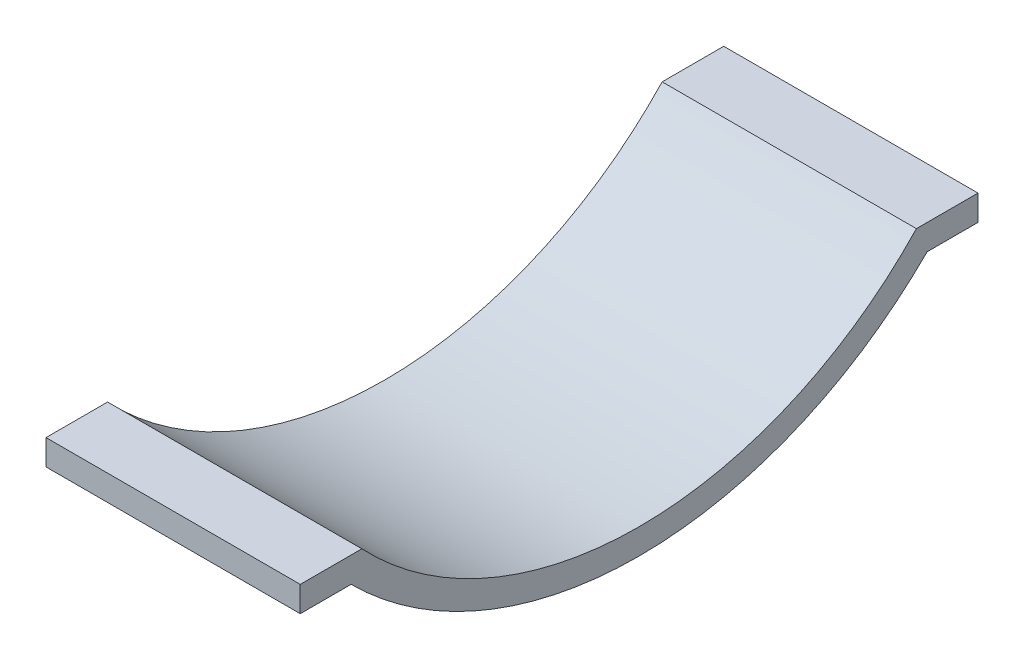
ISO-10303-21;
HEADER;
FILE_DESCRIPTION(('STEP AP214'),'2;1');
FILE_NAME('part.step','',(''),(''),'','','');
FILE_SCHEMA(('AUTOMOTIVE_DESIGN { 1 0 10303 214 1 1 1 1 }'));
ENDSEC;
DATA;
#1=APPLICATION_CONTEXT('core data for automotive mechanical design processes');
#2=APPLICATION_PROTOCOL_DEFINITION('international standard','automotive_design',2000,#1);
#3=PRODUCT_CONTEXT('',#1,'mechanical');
#4=PRODUCT('Part','Part','',(#3));
#5=PRODUCT_RELATED_PRODUCT_CATEGORY('part','',(#4));
#6=PRODUCT_DEFINITION_FORMATION('','',#4);
#7=PRODUCT_DEFINITION_CONTEXT('part definition',#1,'design');
#8=PRODUCT_DEFINITION('design','',#6,#7);
#9=PRODUCT_DEFINITION_SHAPE('','',#8);
#10=(LENGTH_UNIT() NAMED_UNIT(*) SI_UNIT(.MILLI.,.METRE.));
#11=(NAMED_UNIT(*) PLANE_ANGLE_UNIT() SI_UNIT($,.RADIAN.));
#12=(NAMED_UNIT(*) SI_UNIT($,.STERADIAN.) SOLID_ANGLE_UNIT());
#13=UNCERTAINTY_MEASURE_WITH_UNIT(LENGTH_MEASURE(1.E-05),#10,'distance_accuracy_value','');
#14=(GEOMETRIC_REPRESENTATION_CONTEXT(3) GLOBAL_UNCERTAINTY_ASSIGNED_CONTEXT((#13)) GLOBAL_UNIT_ASSIGNED_CONTEXT((#10,
#11,#12)) REPRESENTATION_CONTEXT('',''));
#15=CARTESIAN_POINT('',(0.,0.,0.));
#16=DIRECTION('',(0.,0.,1.));
#17=DIRECTION('',(1.,0.,0.));
#18=AXIS2_PLACEMENT_3D('',#15,#16,#17);
#19=CARTESIAN_POINT('',(-10.,-25.1812231591799,78.56990543216));
#20=DIRECTION('',(1.,0.,0.));
#21=DIRECTION('',(0.,0.,-1.));
#22=AXIS2_PLACEMENT_3D('',#19,#20,#21);
#23=CYLINDRICAL_SURFACE('',#22,16.0000000000003);
#24=CARTESIAN_POINT('',(0.,-25.1812231591799,78.56990543216));
#25=DIRECTION('',(1.,0.,0.));
#26=DIRECTION('',(0.,0.,-1.));
#27=AXIS2_PLACEMENT_3D('',#24,#25,#26);
#28=CIRCLE('',#27,16.0000000000003);
#29=CARTESIAN_POINT('',(0.,-36.4800579978623,89.8984680633227));
#30=VERTEX_POINT('',#29);
#31=CARTESIAN_POINT('',(0.,-36.4800579978601,67.2413428009941));
#32=VERTEX_POINT('',#31);
#33=EDGE_CURVE('E129',#30,#32,#28,.T.);
#34=ORIENTED_EDGE('',*,*,#33,.F.);
#35=DIRECTION('',(1.,0.,0.));
#36=VECTOR('',#35,1.);
#37=CARTESIAN_POINT('',(-10.,-36.4800579978623,89.8984680633227));
#38=LINE('',#37,#36);
#39=CARTESIAN_POINT('',(-10.,-36.4800579978623,89.8984680633227));
#40=VERTEX_POINT('',#39);
#41=EDGE_CURVE('E11',#40,#30,#38,.T.);
#42=ORIENTED_EDGE('',*,*,#41,.F.);
#43=CARTESIAN_POINT('',(-10.,-25.1812231591799,78.56990543216));
#44=DIRECTION('',(1.,0.,0.));
#45=DIRECTION('',(0.,0.,-1.));
#46=AXIS2_PLACEMENT_3D('',#43,#44,#45);
#47=CIRCLE('',#46,16.0000000000003);
#48=CARTESIAN_POINT('',(-10.,-36.4800579978601,67.2413428009941));
#49=VERTEX_POINT('',#48);
#50=EDGE_CURVE('E149',#40,#49,#47,.T.);
#51=ORIENTED_EDGE('',*,*,#50,.T.);
#52=DIRECTION('',(1.,0.,0.));
#53=VECTOR('',#52,1.);
#54=CARTESIAN_POINT('',(-10.,-36.4800579978601,67.2413428009941));
#55=LINE('',#54,#53);
#56=EDGE_CURVE('E35',#49,#32,#55,.T.);
#57=ORIENTED_EDGE('',*,*,#56,.T.);
#58=EDGE_LOOP('',(#34,#42,#51,#57));
#59=FACE_BOUND('',#58,.T.);
#60=ADVANCED_FACE('F32',(#59),#23,.T.);
#61=CARTESIAN_POINT('',(-10.,-36.4800579978623,89.8984680633227));
#62=DIRECTION('',(0.,-1.,0.));
#63=DIRECTION('',(0.,0.,-1.));
#64=AXIS2_PLACEMENT_3D('',#61,#62,#63);
#65=PLANE('',#64);
#66=DIRECTION('',(0.,0.,-1.));
#67=VECTOR('',#66,1.);
#68=CARTESIAN_POINT('',(0.,-36.4800579978623,89.8984680633227));
#69=LINE('',#68,#67);
#70=CARTESIAN_POINT('',(0.,-36.4800579978623,91.8984680633227));
#71=VERTEX_POINT('',#70);
#72=EDGE_CURVE('E147',#71,#30,#69,.T.);
#73=ORIENTED_EDGE('',*,*,#72,.F.);
#74=DIRECTION('',(1.,0.,0.));
#75=VECTOR('',#74,1.);
#76=CARTESIAN_POINT('',(-10.,-36.4800579978623,91.8984680633227));
#77=LINE('',#76,#75);
#78=CARTESIAN_POINT('',(-10.,-36.4800579978623,91.8984680633227));
#79=VERTEX_POINT('',#78);
#80=EDGE_CURVE('E41',#79,#71,#77,.T.);
#81=ORIENTED_EDGE('',*,*,#80,.F.);
#82=DIRECTION('',(0.,0.,-1.));
#83=VECTOR('',#82,1.);
#84=CARTESIAN_POINT('',(-10.,-36.4800579978623,89.8984680633227));
#85=LINE('',#84,#83);
#86=EDGE_CURVE('E119',#79,#40,#85,.T.);
#87=ORIENTED_EDGE('',*,*,#86,.T.);
#88=ORIENTED_EDGE('',*,*,#41,.T.);
#89=EDGE_LOOP('',(#73,#81,#87,#88));
#90=FACE_BOUND('',#89,.T.);
#91=ADVANCED_FACE('F161',(#90),#65,.T.);
#92=CARTESIAN_POINT('',(-10.,-36.4800579978623,91.8984680633227));
#93=DIRECTION('',(0.,0.,1.));
#94=DIRECTION('',(1.,0.,0.));
#95=AXIS2_PLACEMENT_3D('',#92,#93,#94);
#96=PLANE('',#95);
#97=DIRECTION('',(0.,-1.,0.));
#98=VECTOR('',#97,1.);
#99=CARTESIAN_POINT('',(0.,-36.4800579978623,91.8984680633227));
#100=LINE('',#99,#98);
#101=CARTESIAN_POINT('',(0.,-35.4800579978623,91.8984680633227));
#102=VERTEX_POINT('',#101);
#103=EDGE_CURVE('E106',#102,#71,#100,.T.);
#104=ORIENTED_EDGE('',*,*,#103,.F.);
#105=DIRECTION('',(1.,0.,0.));
#106=VECTOR('',#105,1.);
#107=CARTESIAN_POINT('',(-10.,-35.4800579978623,91.8984680633227));
#108=LINE('',#107,#106);
#109=CARTESIAN_POINT('',(-10.,-35.4800579978623,91.8984680633227));
#110=VERTEX_POINT('',#109);
#111=EDGE_CURVE('E101',#110,#102,#108,.T.);
#112=ORIENTED_EDGE('',*,*,#111,.F.);
#113=DIRECTION('',(0.,-1.,0.));
#114=VECTOR('',#113,1.);
#115=CARTESIAN_POINT('',(-10.,-36.4800579978623,91.8984680633227));
#116=LINE('',#115,#114);
#117=EDGE_CURVE('E104',#110,#79,#116,.T.);
#118=ORIENTED_EDGE('',*,*,#117,.T.);
#119=ORIENTED_EDGE('',*,*,#80,.T.);
#120=EDGE_LOOP('',(#104,#112,#118,#119));
#121=FACE_BOUND('',#120,.T.);
#122=ADVANCED_FACE('F103',(#121),#96,.T.);
#123=CARTESIAN_POINT('',(-10.,-35.4800579978623,91.8984680633227));
#124=DIRECTION('',(0.,1.,0.));
#125=DIRECTION('',(0.,0.,1.));
#126=AXIS2_PLACEMENT_3D('',#123,#124,#125);
#127=PLANE('',#126);
#128=DIRECTION('',(0.,0.,1.));
#129=VECTOR('',#128,1.);
#130=CARTESIAN_POINT('',(0.,-35.4800579978623,91.8984680633227));
#131=LINE('',#130,#129);
#132=CARTESIAN_POINT('',(0.,-35.4800579978623,89.4755920664596));
#133=VERTEX_POINT('',#132);
#134=EDGE_CURVE('E144',#133,#102,#131,.T.);
#135=ORIENTED_EDGE('',*,*,#134,.F.);
#136=DIRECTION('',(1.,0.,0.));
#137=VECTOR('',#136,1.);
#138=CARTESIAN_POINT('',(-10.,-35.4800579978623,89.4755920664596));
#139=LINE('',#138,#137);
#140=CARTESIAN_POINT('',(-10.,-35.4800579978623,89.4755920664596));
#141=VERTEX_POINT('',#140);
#142=EDGE_CURVE('E111',#141,#133,#139,.T.);
#143=ORIENTED_EDGE('',*,*,#142,.F.);
#144=DIRECTION('',(0.,0.,1.));
#145=VECTOR('',#144,1.);
#146=CARTESIAN_POINT('',(-10.,-35.4800579978623,91.8984680633227));
#147=LINE('',#146,#145);
#148=EDGE_CURVE('E117',#141,#110,#147,.T.);
#149=ORIENTED_EDGE('',*,*,#148,.T.);
#150=ORIENTED_EDGE('',*,*,#111,.T.);
#151=EDGE_LOOP('',(#135,#143,#149,#150));
#152=FACE_BOUND('',#151,.T.);
#153=ADVANCED_FACE('F121',(#152),#127,.T.);
#154=CARTESIAN_POINT('',(-10.,-25.1812231591799,78.56990543216));
#155=DIRECTION('',(1.,0.,0.));
#156=DIRECTION('',(0.,0.,-1.));
#157=AXIS2_PLACEMENT_3D('',#154,#155,#156);
#158=CYLINDRICAL_SURFACE('',#157,15.0000000000004);
#159=CARTESIAN_POINT('',(0.,-25.1812231591799,78.56990543216));
#160=DIRECTION('',(-1.,0.,0.));
#161=DIRECTION('',(0.,0.,-1.));
#162=AXIS2_PLACEMENT_3D('',#159,#160,#161);
#163=CIRCLE('',#162,15.0000000000004);
#164=CARTESIAN_POINT('',(0.,-35.4800579978599,67.6642187978576));
#165=VERTEX_POINT('',#164);
#166=EDGE_CURVE('E141',#165,#133,#163,.T.);
#167=ORIENTED_EDGE('',*,*,#166,.F.);
#168=DIRECTION('',(1.,0.,0.));
#169=VECTOR('',#168,1.);
#170=CARTESIAN_POINT('',(-10.,-35.4800579978599,67.6642187978576));
#171=LINE('',#170,#169);
#172=CARTESIAN_POINT('',(-10.,-35.4800579978599,67.6642187978576));
#173=VERTEX_POINT('',#172);
#174=EDGE_CURVE('E153',#173,#165,#171,.T.);
#175=ORIENTED_EDGE('',*,*,#174,.F.);
#176=CARTESIAN_POINT('',(-10.,-25.1812231591799,78.56990543216));
#177=DIRECTION('',(-1.,0.,0.));
#178=DIRECTION('',(0.,0.,-1.));
#179=AXIS2_PLACEMENT_3D('',#176,#177,#178);
#180=CIRCLE('',#179,15.0000000000004);
#181=EDGE_CURVE('E122',#173,#141,#180,.T.);
#182=ORIENTED_EDGE('',*,*,#181,.T.);
#183=ORIENTED_EDGE('',*,*,#142,.T.);
#184=EDGE_LOOP('',(#167,#175,#182,#183));
#185=FACE_BOUND('',#184,.T.);
#186=ADVANCED_FACE('F174',(#185),#158,.F.);
#187=CARTESIAN_POINT('',(-10.,-35.4800579978601,65.2413428009943));
#188=DIRECTION('',(0.,1.,0.));
#189=DIRECTION('',(0.,0.,1.));
#190=AXIS2_PLACEMENT_3D('',#187,#188,#189);
#191=PLANE('',#190);
#192=DIRECTION('',(0.,0.,1.));
#193=VECTOR('',#192,1.);
#194=CARTESIAN_POINT('',(0.,-35.4800579978601,65.2413428009943));
#195=LINE('',#194,#193);
#196=CARTESIAN_POINT('',(0.,-35.4800579978601,65.2413428009943));
#197=VERTEX_POINT('',#196);
#198=EDGE_CURVE('E138',#197,#165,#195,.T.);
#199=ORIENTED_EDGE('',*,*,#198,.F.);
#200=DIRECTION('',(1.,0.,0.));
#201=VECTOR('',#200,1.);
#202=CARTESIAN_POINT('',(-10.,-35.4800579978601,65.2413428009943));
#203=LINE('',#202,#201);
#204=CARTESIAN_POINT('',(-10.,-35.4800579978601,65.2413428009943));
#205=VERTEX_POINT('',#204);
#206=EDGE_CURVE('E155',#205,#197,#203,.T.);
#207=ORIENTED_EDGE('',*,*,#206,.F.);
#208=DIRECTION('',(0.,0.,1.));
#209=VECTOR('',#208,1.);
#210=CARTESIAN_POINT('',(-10.,-35.4800579978601,65.2413428009943));
#211=LINE('',#210,#209);
#212=EDGE_CURVE('E124',#205,#173,#211,.T.);
#213=ORIENTED_EDGE('',*,*,#212,.T.);
#214=ORIENTED_EDGE('',*,*,#174,.T.);
#215=EDGE_LOOP('',(#199,#207,#213,#214));
#216=FACE_BOUND('',#215,.T.);
#217=ADVANCED_FACE('F177',(#216),#191,.T.);
#218=CARTESIAN_POINT('',(-10.,-36.4800579978601,65.2413428009943));
#219=DIRECTION('',(0.,0.,-1.));
#220=DIRECTION('',(-1.,0.,0.));
#221=AXIS2_PLACEMENT_3D('',#218,#219,#220);
#222=PLANE('',#221);
#223=DIRECTION('',(0.,1.,0.));
#224=VECTOR('',#223,1.);
#225=CARTESIAN_POINT('',(0.,-36.4800579978601,65.2413428009943));
#226=LINE('',#225,#224);
#227=CARTESIAN_POINT('',(0.,-36.4800579978601,65.2413428009943));
#228=VERTEX_POINT('',#227);
#229=EDGE_CURVE('E135',#228,#197,#226,.T.);
#230=ORIENTED_EDGE('',*,*,#229,.F.);
#231=DIRECTION('',(1.,0.,0.));
#232=VECTOR('',#231,1.);
#233=CARTESIAN_POINT('',(-10.,-36.4800579978601,65.2413428009943));
#234=LINE('',#233,#232);
#235=CARTESIAN_POINT('',(-10.,-36.4800579978601,65.2413428009943));
#236=VERTEX_POINT('',#235);
#237=EDGE_CURVE('E156',#236,#228,#234,.T.);
#238=ORIENTED_EDGE('',*,*,#237,.F.);
#239=DIRECTION('',(0.,1.,0.));
#240=VECTOR('',#239,1.);
#241=CARTESIAN_POINT('',(-10.,-36.4800579978601,65.2413428009943));
#242=LINE('',#241,#240);
#243=EDGE_CURVE('E252',#236,#205,#242,.T.);
#244=ORIENTED_EDGE('',*,*,#243,.T.);
#245=ORIENTED_EDGE('',*,*,#206,.T.);
#246=EDGE_LOOP('',(#230,#238,#244,#245));
#247=FACE_BOUND('',#246,.T.);
#248=ADVANCED_FACE('F181',(#247),#222,.T.);
#249=CARTESIAN_POINT('',(-10.,-36.4800579978601,67.2413428009941));
#250=DIRECTION('',(0.,-1.,0.));
#251=DIRECTION('',(0.,0.,-1.));
#252=AXIS2_PLACEMENT_3D('',#249,#250,#251);
#253=PLANE('',#252);
#254=DIRECTION('',(0.,0.,-1.));
#255=VECTOR('',#254,1.);
#256=CARTESIAN_POINT('',(0.,-36.4800579978601,67.2413428009941));
#257=LINE('',#256,#255);
#258=EDGE_CURVE('E132',#32,#228,#257,.T.);
#259=ORIENTED_EDGE('',*,*,#258,.F.);
#260=ORIENTED_EDGE('',*,*,#56,.F.);
#261=DIRECTION('',(0.,0.,-1.));
#262=VECTOR('',#261,1.);
#263=CARTESIAN_POINT('',(-10.,-36.4800579978601,67.2413428009941));
#264=LINE('',#263,#262);
#265=EDGE_CURVE('E253',#49,#236,#264,.T.);
#266=ORIENTED_EDGE('',*,*,#265,.T.);
#267=ORIENTED_EDGE('',*,*,#237,.T.);
#268=EDGE_LOOP('',(#259,#260,#266,#267));
#269=FACE_BOUND('',#268,.T.);
#270=ADVANCED_FACE('F158',(#269),#253,.T.);
#271=CARTESIAN_POINT('',(-10.,-25.1812231591799,78.56990543216));
#272=DIRECTION('',(1.,0.,0.));
#273=DIRECTION('',(0.,0.,-1.));
#274=AXIS2_PLACEMENT_3D('',#271,#272,#273);
#275=PLANE('',#274);
#276=ORIENTED_EDGE('',*,*,#50,.F.);
#277=ORIENTED_EDGE('',*,*,#86,.F.);
#278=ORIENTED_EDGE('',*,*,#117,.F.);
#279=ORIENTED_EDGE('',*,*,#148,.F.);
#280=ORIENTED_EDGE('',*,*,#181,.F.);
#281=ORIENTED_EDGE('',*,*,#212,.F.);
#282=ORIENTED_EDGE('',*,*,#243,.F.);
#283=ORIENTED_EDGE('',*,*,#265,.F.);
#284=EDGE_LOOP('',(#276,#277,#278,#279,#280,#281,#282,#283));
#285=FACE_BOUND('',#284,.T.);
#286=ADVANCED_FACE('F115',(#285),#275,.F.);
#287=CARTESIAN_POINT('',(0.,-25.1812231591799,78.56990543216));
#288=DIRECTION('',(1.,0.,0.));
#289=DIRECTION('',(0.,0.,-1.));
#290=AXIS2_PLACEMENT_3D('',#287,#288,#289);
#291=PLANE('',#290);
#292=ORIENTED_EDGE('',*,*,#33,.T.);
#293=ORIENTED_EDGE('',*,*,#258,.T.);
#294=ORIENTED_EDGE('',*,*,#229,.T.);
#295=ORIENTED_EDGE('',*,*,#198,.T.);
#296=ORIENTED_EDGE('',*,*,#166,.T.);
#297=ORIENTED_EDGE('',*,*,#134,.T.);
#298=ORIENTED_EDGE('',*,*,#103,.T.);
#299=ORIENTED_EDGE('',*,*,#72,.T.);
#300=EDGE_LOOP('',(#292,#293,#294,#295,#296,#297,#298,#299));
#301=FACE_BOUND('',#300,.T.);
#302=ADVANCED_FACE('F160',(#301),#291,.T.);
#303=CLOSED_SHELL('',(#60,#91,#122,#153,#186,#217,#248,#270,#286,#302));
#304=MANIFOLD_SOLID_BREP('B2',#303);
#305=ADVANCED_BREP_SHAPE_REPRESENTATION('',(#18,#304),#14);
#306=SHAPE_DEFINITION_REPRESENTATION(#9,#305);
ENDSEC;
END-ISO-10303-21;
